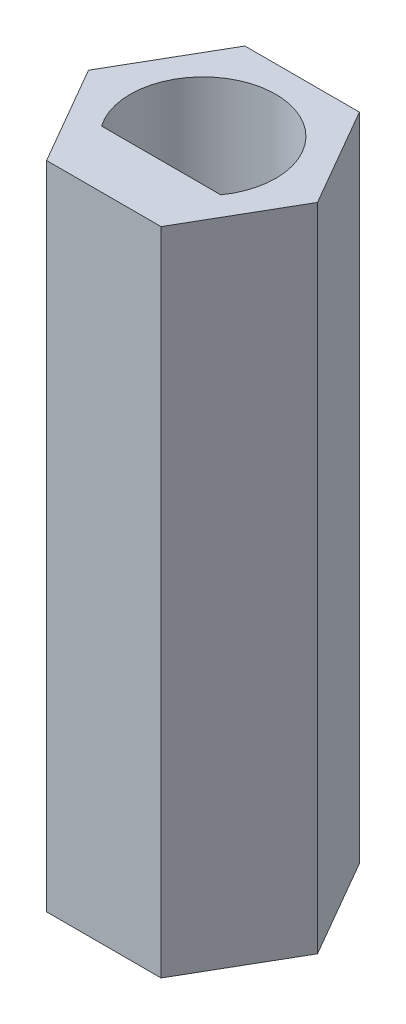
ISO-10303-21;
HEADER;
FILE_DESCRIPTION(('STEP AP214'),'2;1');
FILE_NAME('part.step','',(''),(''),'','','');
FILE_SCHEMA(('AUTOMOTIVE_DESIGN { 1 0 10303 214 1 1 1 1 }'));
ENDSEC;
DATA;
#1=APPLICATION_CONTEXT('core data for automotive mechanical design processes');
#2=APPLICATION_PROTOCOL_DEFINITION('international standard','automotive_design',2000,#1);
#3=PRODUCT_CONTEXT('',#1,'mechanical');
#4=PRODUCT('Part','Part','',(#3));
#5=PRODUCT_RELATED_PRODUCT_CATEGORY('part','',(#4));
#6=PRODUCT_DEFINITION_FORMATION('','',#4);
#7=PRODUCT_DEFINITION_CONTEXT('part definition',#1,'design');
#8=PRODUCT_DEFINITION('design','',#6,#7);
#9=PRODUCT_DEFINITION_SHAPE('','',#8);
#10=(LENGTH_UNIT() NAMED_UNIT(*) SI_UNIT(.MILLI.,.METRE.));
#11=(NAMED_UNIT(*) PLANE_ANGLE_UNIT() SI_UNIT($,.RADIAN.));
#12=(NAMED_UNIT(*) SI_UNIT($,.STERADIAN.) SOLID_ANGLE_UNIT());
#13=UNCERTAINTY_MEASURE_WITH_UNIT(LENGTH_MEASURE(1.E-05),#10,'distance_accuracy_value','');
#14=(GEOMETRIC_REPRESENTATION_CONTEXT(3) GLOBAL_UNCERTAINTY_ASSIGNED_CONTEXT((#13)) GLOBAL_UNIT_ASSIGNED_CONTEXT((#10,
#11,#12)) REPRESENTATION_CONTEXT('',''));
#15=CARTESIAN_POINT('',(0.,0.,0.));
#16=DIRECTION('',(0.,0.,1.));
#17=DIRECTION('',(1.,0.,0.));
#18=AXIS2_PLACEMENT_3D('',#15,#16,#17);
#19=CARTESIAN_POINT('',(1.84752086140682,28.,3.2));
#20=DIRECTION('',(-0.866025403784438,0.,-0.5));
#21=DIRECTION('',(-0.5,0.,0.866025403784439));
#22=AXIS2_PLACEMENT_3D('',#19,#20,#21);
#23=PLANE('',#22);
#24=DIRECTION('',(-0.5,0.,0.866025403784439));
#25=VECTOR('',#24,1.);
#26=CARTESIAN_POINT('',(1.84752086140682,7.,3.2));
#27=LINE('',#26,#25);
#28=CARTESIAN_POINT('',(3.69504172281362,7.,0.));
#29=VERTEX_POINT('',#28);
#30=CARTESIAN_POINT('',(1.84752086140682,7.,3.2));
#31=VERTEX_POINT('',#30);
#32=EDGE_CURVE('E55',#29,#31,#27,.T.);
#33=ORIENTED_EDGE('',*,*,#32,.F.);
#34=DIRECTION('',(0.,-1.,0.));
#35=VECTOR('',#34,1.);
#36=CARTESIAN_POINT('',(3.69504172281362,28.,0.));
#37=LINE('',#36,#35);
#38=CARTESIAN_POINT('',(3.69504172281362,28.,0.));
#39=VERTEX_POINT('',#38);
#40=EDGE_CURVE('E11',#39,#29,#37,.T.);
#41=ORIENTED_EDGE('',*,*,#40,.F.);
#42=DIRECTION('',(0.5,0.,-0.866025403784438));
#43=VECTOR('',#42,1.);
#44=CARTESIAN_POINT('',(1.84752086140682,28.,3.2));
#45=LINE('',#44,#43);
#46=CARTESIAN_POINT('',(1.84752086140682,28.,3.2));
#47=VERTEX_POINT('',#46);
#48=EDGE_CURVE('E187',#47,#39,#45,.T.);
#49=ORIENTED_EDGE('',*,*,#48,.F.);
#50=DIRECTION('',(0.,-1.,0.));
#51=VECTOR('',#50,1.);
#52=CARTESIAN_POINT('',(1.84752086140682,28.,3.2));
#53=LINE('',#52,#51);
#54=EDGE_CURVE('E128',#47,#31,#53,.T.);
#55=ORIENTED_EDGE('',*,*,#54,.T.);
#56=EDGE_LOOP('',(#33,#41,#49,#55));
#57=FACE_BOUND('',#56,.T.);
#58=ADVANCED_FACE('F39',(#57),#23,.F.);
#59=CARTESIAN_POINT('',(3.69504172281362,28.,0.));
#60=DIRECTION('',(-0.866025403784438,0.,0.500000000000001));
#61=DIRECTION('',(0.500000000000001,0.,0.866025403784438));
#62=AXIS2_PLACEMENT_3D('',#59,#60,#61);
#63=PLANE('',#62);
#64=DIRECTION('',(0.500000000000001,0.,0.866025403784438));
#65=VECTOR('',#64,1.);
#66=CARTESIAN_POINT('',(3.69504172281362,7.,0.));
#67=LINE('',#66,#65);
#68=CARTESIAN_POINT('',(1.8475208614068,7.,-3.20000000000001));
#69=VERTEX_POINT('',#68);
#70=EDGE_CURVE('E155',#69,#29,#67,.T.);
#71=ORIENTED_EDGE('',*,*,#70,.F.);
#72=DIRECTION('',(0.,-1.,0.));
#73=VECTOR('',#72,1.);
#74=CARTESIAN_POINT('',(1.8475208614068,28.,-3.20000000000001));
#75=LINE('',#74,#73);
#76=CARTESIAN_POINT('',(1.8475208614068,28.,-3.20000000000001));
#77=VERTEX_POINT('',#76);
#78=EDGE_CURVE('E48',#77,#69,#75,.T.);
#79=ORIENTED_EDGE('',*,*,#78,.F.);
#80=DIRECTION('',(-0.500000000000001,0.,-0.866025403784438));
#81=VECTOR('',#80,1.);
#82=CARTESIAN_POINT('',(3.69504172281362,28.,0.));
#83=LINE('',#82,#81);
#84=EDGE_CURVE('E153',#39,#77,#83,.T.);
#85=ORIENTED_EDGE('',*,*,#84,.F.);
#86=ORIENTED_EDGE('',*,*,#40,.T.);
#87=EDGE_LOOP('',(#71,#79,#85,#86));
#88=FACE_BOUND('',#87,.T.);
#89=ADVANCED_FACE('F152',(#88),#63,.F.);
#90=CARTESIAN_POINT('',(1.8475208614068,28.,-3.20000000000001));
#91=DIRECTION('',(0.,0.,1.));
#92=DIRECTION('',(1.,0.,0.));
#93=AXIS2_PLACEMENT_3D('',#90,#91,#92);
#94=PLANE('',#93);
#95=DIRECTION('',(1.,0.,0.));
#96=VECTOR('',#95,1.);
#97=CARTESIAN_POINT('',(1.8475208614068,7.,-3.20000000000001));
#98=LINE('',#97,#96);
#99=CARTESIAN_POINT('',(-1.84752086140681,7.,-3.20000000000001));
#100=VERTEX_POINT('',#99);
#101=EDGE_CURVE('E148',#100,#69,#98,.T.);
#102=ORIENTED_EDGE('',*,*,#101,.F.);
#103=DIRECTION('',(0.,-1.,0.));
#104=VECTOR('',#103,1.);
#105=CARTESIAN_POINT('',(-1.84752086140681,28.,-3.20000000000001));
#106=LINE('',#105,#104);
#107=CARTESIAN_POINT('',(-1.84752086140681,28.,-3.20000000000001));
#108=VERTEX_POINT('',#107);
#109=EDGE_CURVE('E132',#108,#100,#106,.T.);
#110=ORIENTED_EDGE('',*,*,#109,.F.);
#111=DIRECTION('',(-1.,0.,0.));
#112=VECTOR('',#111,1.);
#113=CARTESIAN_POINT('',(1.8475208614068,28.,-3.20000000000001));
#114=LINE('',#113,#112);
#115=EDGE_CURVE('E149',#77,#108,#114,.T.);
#116=ORIENTED_EDGE('',*,*,#115,.F.);
#117=ORIENTED_EDGE('',*,*,#78,.T.);
#118=EDGE_LOOP('',(#102,#110,#116,#117));
#119=FACE_BOUND('',#118,.T.);
#120=ADVANCED_FACE('F146',(#119),#94,.F.);
#121=CARTESIAN_POINT('',(-1.84752086140681,28.,-3.20000000000001));
#122=DIRECTION('',(0.866025403784439,0.,0.5));
#123=DIRECTION('',(0.5,0.,-0.866025403784439));
#124=AXIS2_PLACEMENT_3D('',#121,#122,#123);
#125=PLANE('',#124);
#126=DIRECTION('',(0.5,0.,-0.866025403784439));
#127=VECTOR('',#126,1.);
#128=CARTESIAN_POINT('',(-1.84752086140681,7.,-3.20000000000001));
#129=LINE('',#128,#127);
#130=CARTESIAN_POINT('',(-3.69504172281361,7.,0.));
#131=VERTEX_POINT('',#130);
#132=EDGE_CURVE('E123',#131,#100,#129,.T.);
#133=ORIENTED_EDGE('',*,*,#132,.F.);
#134=DIRECTION('',(0.,-1.,0.));
#135=VECTOR('',#134,1.);
#136=CARTESIAN_POINT('',(-3.69504172281361,28.,0.));
#137=LINE('',#136,#135);
#138=CARTESIAN_POINT('',(-3.69504172281361,28.,0.));
#139=VERTEX_POINT('',#138);
#140=EDGE_CURVE('E121',#139,#131,#137,.T.);
#141=ORIENTED_EDGE('',*,*,#140,.F.);
#142=DIRECTION('',(-0.5,0.,0.866025403784439));
#143=VECTOR('',#142,1.);
#144=CARTESIAN_POINT('',(-1.84752086140681,28.,-3.20000000000001));
#145=LINE('',#144,#143);
#146=EDGE_CURVE('E196',#108,#139,#145,.T.);
#147=ORIENTED_EDGE('',*,*,#146,.F.);
#148=ORIENTED_EDGE('',*,*,#109,.T.);
#149=EDGE_LOOP('',(#133,#141,#147,#148));
#150=FACE_BOUND('',#149,.T.);
#151=ADVANCED_FACE('F213',(#150),#125,.F.);
#152=CARTESIAN_POINT('',(-3.69504172281361,28.,0.));
#153=DIRECTION('',(0.866025403784438,0.,-0.5));
#154=DIRECTION('',(-0.5,0.,-0.866025403784438));
#155=AXIS2_PLACEMENT_3D('',#152,#153,#154);
#156=PLANE('',#155);
#157=DIRECTION('',(-0.5,0.,-0.866025403784438));
#158=VECTOR('',#157,1.);
#159=CARTESIAN_POINT('',(-3.69504172281361,7.,0.));
#160=LINE('',#159,#158);
#161=CARTESIAN_POINT('',(-1.84752086140681,7.,3.2));
#162=VERTEX_POINT('',#161);
#163=EDGE_CURVE('E105',#162,#131,#160,.T.);
#164=ORIENTED_EDGE('',*,*,#163,.F.);
#165=DIRECTION('',(0.,-1.,0.));
#166=VECTOR('',#165,1.);
#167=CARTESIAN_POINT('',(-1.84752086140681,28.,3.2));
#168=LINE('',#167,#166);
#169=CARTESIAN_POINT('',(-1.84752086140681,28.,3.2));
#170=VERTEX_POINT('',#169);
#171=EDGE_CURVE('E118',#170,#162,#168,.T.);
#172=ORIENTED_EDGE('',*,*,#171,.F.);
#173=DIRECTION('',(0.5,0.,0.866025403784438));
#174=VECTOR('',#173,1.);
#175=CARTESIAN_POINT('',(-3.69504172281361,28.,0.));
#176=LINE('',#175,#174);
#177=EDGE_CURVE('E199',#139,#170,#176,.T.);
#178=ORIENTED_EDGE('',*,*,#177,.F.);
#179=ORIENTED_EDGE('',*,*,#140,.T.);
#180=EDGE_LOOP('',(#164,#172,#178,#179));
#181=FACE_BOUND('',#180,.T.);
#182=ADVANCED_FACE('F116',(#181),#156,.F.);
#183=CARTESIAN_POINT('',(-1.84752086140681,28.,3.2));
#184=DIRECTION('',(0.,0.,-1.));
#185=DIRECTION('',(-1.,0.,0.));
#186=AXIS2_PLACEMENT_3D('',#183,#184,#185);
#187=PLANE('',#186);
#188=DIRECTION('',(-1.,0.,0.));
#189=VECTOR('',#188,1.);
#190=CARTESIAN_POINT('',(-1.84752086140681,7.,3.2));
#191=LINE('',#190,#189);
#192=EDGE_CURVE('E102',#31,#162,#191,.T.);
#193=ORIENTED_EDGE('',*,*,#192,.F.);
#194=ORIENTED_EDGE('',*,*,#54,.F.);
#195=DIRECTION('',(1.,0.,0.));
#196=VECTOR('',#195,1.);
#197=CARTESIAN_POINT('',(-1.84752086140681,28.,3.2));
#198=LINE('',#197,#196);
#199=EDGE_CURVE('E126',#170,#47,#198,.T.);
#200=ORIENTED_EDGE('',*,*,#199,.F.);
#201=ORIENTED_EDGE('',*,*,#171,.T.);
#202=EDGE_LOOP('',(#193,#194,#200,#201));
#203=FACE_BOUND('',#202,.T.);
#204=ADVANCED_FACE('F125',(#203),#187,.F.);
#205=CARTESIAN_POINT('',(0.,28.,0.));
#206=DIRECTION('',(0.,1.,0.));
#207=DIRECTION('',(0.,0.,1.));
#208=AXIS2_PLACEMENT_3D('',#205,#206,#207);
#209=PLANE('',#208);
#210=CARTESIAN_POINT('',(0.,28.,0.));
#211=DIRECTION('',(0.,1.,0.));
#212=DIRECTION('',(0.,0.,1.));
#213=AXIS2_PLACEMENT_3D('',#210,#211,#212);
#214=CIRCLE('',#213,2.35);
#215=CARTESIAN_POINT('',(1.92353840616713,28.,1.35));
#216=VERTEX_POINT('',#215);
#217=CARTESIAN_POINT('',(-1.92353840616713,28.,1.35));
#218=VERTEX_POINT('',#217);
#219=EDGE_CURVE('E63',#216,#218,#214,.T.);
#220=ORIENTED_EDGE('',*,*,#219,.F.);
#221=DIRECTION('',(1.,0.,0.));
#222=VECTOR('',#221,1.);
#223=CARTESIAN_POINT('',(-1.92353840616713,28.,1.35));
#224=LINE('',#223,#222);
#225=EDGE_CURVE('E174',#218,#216,#224,.T.);
#226=ORIENTED_EDGE('',*,*,#225,.F.);
#227=EDGE_LOOP('',(#220,#226));
#228=FACE_BOUND('',#227,.T.);
#229=ORIENTED_EDGE('',*,*,#48,.T.);
#230=ORIENTED_EDGE('',*,*,#84,.T.);
#231=ORIENTED_EDGE('',*,*,#115,.T.);
#232=ORIENTED_EDGE('',*,*,#146,.T.);
#233=ORIENTED_EDGE('',*,*,#177,.T.);
#234=ORIENTED_EDGE('',*,*,#199,.T.);
#235=EDGE_LOOP('',(#229,#230,#231,#232,#233,#234));
#236=FACE_BOUND('',#235,.T.);
#237=ADVANCED_FACE('F203',(#228,#236),#209,.T.);
#238=CARTESIAN_POINT('',(0.,19.7,0.));
#239=DIRECTION('',(0.,1.,0.));
#240=DIRECTION('',(0.,0.,1.));
#241=AXIS2_PLACEMENT_3D('',#238,#239,#240);
#242=CYLINDRICAL_SURFACE('',#241,2.35);
#243=ORIENTED_EDGE('',*,*,#219,.T.);
#244=DIRECTION('',(0.,1.,0.));
#245=VECTOR('',#244,1.);
#246=CARTESIAN_POINT('',(-1.92353840616713,19.7,1.35));
#247=LINE('',#246,#245);
#248=CARTESIAN_POINT('',(-1.92353840616713,19.7,1.35));
#249=VERTEX_POINT('',#248);
#250=EDGE_CURVE('E178',#249,#218,#247,.T.);
#251=ORIENTED_EDGE('',*,*,#250,.F.);
#252=CARTESIAN_POINT('',(0.,19.7,0.));
#253=DIRECTION('',(0.,1.,0.));
#254=DIRECTION('',(0.,0.,1.));
#255=AXIS2_PLACEMENT_3D('',#252,#253,#254);
#256=CIRCLE('',#255,2.35);
#257=CARTESIAN_POINT('',(1.92353840616713,19.7,1.35));
#258=VERTEX_POINT('',#257);
#259=EDGE_CURVE('E169',#258,#249,#256,.T.);
#260=ORIENTED_EDGE('',*,*,#259,.F.);
#261=DIRECTION('',(0.,1.,0.));
#262=VECTOR('',#261,1.);
#263=CARTESIAN_POINT('',(1.92353840616713,19.7,1.35));
#264=LINE('',#263,#262);
#265=EDGE_CURVE('E184',#258,#216,#264,.T.);
#266=ORIENTED_EDGE('',*,*,#265,.T.);
#267=EDGE_LOOP('',(#243,#251,#260,#266));
#268=FACE_BOUND('',#267,.T.);
#269=ADVANCED_FACE('F225',(#268),#242,.F.);
#270=CARTESIAN_POINT('',(-1.92353840616713,19.7,1.35));
#271=DIRECTION('',(0.,0.,1.));
#272=DIRECTION('',(1.,0.,0.));
#273=AXIS2_PLACEMENT_3D('',#270,#271,#272);
#274=PLANE('',#273);
#275=ORIENTED_EDGE('',*,*,#225,.T.);
#276=ORIENTED_EDGE('',*,*,#265,.F.);
#277=DIRECTION('',(1.,0.,0.));
#278=VECTOR('',#277,1.);
#279=CARTESIAN_POINT('',(-1.92353840616713,19.7,1.35));
#280=LINE('',#279,#278);
#281=EDGE_CURVE('E173',#249,#258,#280,.T.);
#282=ORIENTED_EDGE('',*,*,#281,.F.);
#283=ORIENTED_EDGE('',*,*,#250,.T.);
#284=EDGE_LOOP('',(#275,#276,#282,#283));
#285=FACE_BOUND('',#284,.T.);
#286=ADVANCED_FACE('F229',(#285),#274,.F.);
#287=CARTESIAN_POINT('',(0.,19.7,0.));
#288=DIRECTION('',(0.,1.,0.));
#289=DIRECTION('',(0.,0.,1.));
#290=AXIS2_PLACEMENT_3D('',#287,#288,#289);
#291=PLANE('',#290);
#292=ORIENTED_EDGE('',*,*,#259,.T.);
#293=ORIENTED_EDGE('',*,*,#281,.T.);
#294=EDGE_LOOP('',(#292,#293));
#295=FACE_BOUND('',#294,.T.);
#296=ADVANCED_FACE('F232',(#295),#291,.T.);
#297=CARTESIAN_POINT('',(0.,7.,0.));
#298=DIRECTION('',(0.,-1.,0.));
#299=DIRECTION('',(0.,0.,-1.));
#300=AXIS2_PLACEMENT_3D('',#297,#298,#299);
#301=PLANE('',#300);
#302=CARTESIAN_POINT('',(0.,7.,0.));
#303=DIRECTION('',(0.,-1.,0.));
#304=DIRECTION('',(0.,0.,-1.));
#305=AXIS2_PLACEMENT_3D('',#302,#303,#304);
#306=CIRCLE('',#305,1.5);
#307=CARTESIAN_POINT('',(0.,7.,-1.5));
#308=VERTEX_POINT('',#307);
#309=EDGE_CURVE('E42',#308,#308,#306,.F.);
#310=ORIENTED_EDGE('',*,*,#309,.T.);
#311=EDGE_LOOP('',(#310));
#312=FACE_BOUND('',#311,.T.);
#313=ORIENTED_EDGE('',*,*,#32,.T.);
#314=ORIENTED_EDGE('',*,*,#192,.T.);
#315=ORIENTED_EDGE('',*,*,#163,.T.);
#316=ORIENTED_EDGE('',*,*,#132,.T.);
#317=ORIENTED_EDGE('',*,*,#101,.T.);
#318=ORIENTED_EDGE('',*,*,#70,.T.);
#319=EDGE_LOOP('',(#313,#314,#315,#316,#317,#318));
#320=FACE_BOUND('',#319,.T.);
#321=ADVANCED_FACE('F104',(#312,#320),#301,.T.);
#322=CARTESIAN_POINT('',(0.,18.,0.));
#323=DIRECTION('',(0.,-1.,0.));
#324=DIRECTION('',(0.,0.,-1.));
#325=AXIS2_PLACEMENT_3D('',#322,#323,#324);
#326=PLANE('',#325);
#327=CARTESIAN_POINT('',(0.,18.,0.));
#328=DIRECTION('',(0.,-1.,0.));
#329=DIRECTION('',(0.,0.,-1.));
#330=AXIS2_PLACEMENT_3D('',#327,#328,#329);
#331=CIRCLE('',#330,1.5);
#332=CARTESIAN_POINT('',(0.,18.,-1.5));
#333=VERTEX_POINT('',#332);
#334=EDGE_CURVE('E161',#333,#333,#331,.T.);
#335=ORIENTED_EDGE('',*,*,#334,.T.);
#336=EDGE_LOOP('',(#335));
#337=FACE_BOUND('',#336,.T.);
#338=ADVANCED_FACE('F240',(#337),#326,.T.);
#339=CARTESIAN_POINT('',(0.,18.,0.));
#340=DIRECTION('',(0.,-1.,0.));
#341=DIRECTION('',(0.,0.,-1.));
#342=AXIS2_PLACEMENT_3D('',#339,#340,#341);
#343=CYLINDRICAL_SURFACE('',#342,1.5);
#344=ORIENTED_EDGE('',*,*,#334,.F.);
#345=EDGE_LOOP('',(#344));
#346=FACE_BOUND('',#345,.T.);
#347=ORIENTED_EDGE('',*,*,#309,.F.);
#348=EDGE_LOOP('',(#347));
#349=FACE_BOUND('',#348,.T.);
#350=ADVANCED_FACE('F237',(#346,#349),#343,.F.);
#351=CLOSED_SHELL('',(#58,#89,#120,#151,#182,#204,#237,#269,#286,#296,#321,#338,#350));
#352=MANIFOLD_SOLID_BREP('B2',#351);
#353=ADVANCED_BREP_SHAPE_REPRESENTATION('',(#18,#352),#14);
#354=SHAPE_DEFINITION_REPRESENTATION(#9,#353);
ENDSEC;
END-ISO-10303-21;
